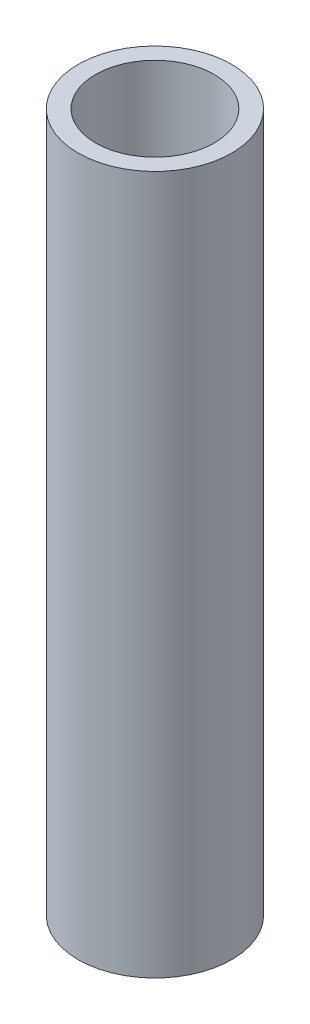
ISO-10303-21;
HEADER;
FILE_DESCRIPTION(('STEP AP214'),'2;1');
FILE_NAME('part.step','',(''),(''),'','','');
FILE_SCHEMA(('AUTOMOTIVE_DESIGN { 1 0 10303 214 1 1 1 1 }'));
ENDSEC;
DATA;
#1=APPLICATION_CONTEXT('core data for automotive mechanical design processes');
#2=APPLICATION_PROTOCOL_DEFINITION('international standard','automotive_design',2000,#1);
#3=PRODUCT_CONTEXT('',#1,'mechanical');
#4=PRODUCT('Part','Part','',(#3));
#5=PRODUCT_RELATED_PRODUCT_CATEGORY('part','',(#4));
#6=PRODUCT_DEFINITION_FORMATION('','',#4);
#7=PRODUCT_DEFINITION_CONTEXT('part definition',#1,'design');
#8=PRODUCT_DEFINITION('design','',#6,#7);
#9=PRODUCT_DEFINITION_SHAPE('','',#8);
#10=(LENGTH_UNIT() NAMED_UNIT(*) SI_UNIT(.MILLI.,.METRE.));
#11=(NAMED_UNIT(*) PLANE_ANGLE_UNIT() SI_UNIT($,.RADIAN.));
#12=(NAMED_UNIT(*) SI_UNIT($,.STERADIAN.) SOLID_ANGLE_UNIT());
#13=UNCERTAINTY_MEASURE_WITH_UNIT(LENGTH_MEASURE(1.E-05),#10,'distance_accuracy_value','');
#14=(GEOMETRIC_REPRESENTATION_CONTEXT(3) GLOBAL_UNCERTAINTY_ASSIGNED_CONTEXT((#13)) GLOBAL_UNIT_ASSIGNED_CONTEXT((#10,
#11,#12)) REPRESENTATION_CONTEXT('',''));
#15=CARTESIAN_POINT('',(0.,0.,0.));
#16=DIRECTION('',(0.,0.,1.));
#17=DIRECTION('',(1.,0.,0.));
#18=AXIS2_PLACEMENT_3D('',#15,#16,#17);
#19=CARTESIAN_POINT('',(0.,100.,0.));
#20=DIRECTION('',(0.,1.,0.));
#21=DIRECTION('',(0.,0.,1.));
#22=AXIS2_PLACEMENT_3D('',#19,#20,#21);
#23=PLANE('',#22);
#24=CARTESIAN_POINT('',(0.,100.,0.));
#25=DIRECTION('',(0.,1.,0.));
#26=DIRECTION('',(0.,0.,1.));
#27=AXIS2_PLACEMENT_3D('',#24,#25,#26);
#28=CIRCLE('',#27,11.);
#29=CARTESIAN_POINT('',(0.,100.,11.));
#30=VERTEX_POINT('',#29);
#31=EDGE_CURVE('E10',#30,#30,#28,.T.);
#32=ORIENTED_EDGE('',*,*,#31,.T.);
#33=EDGE_LOOP('',(#32));
#34=FACE_BOUND('',#33,.T.);
#35=CARTESIAN_POINT('',(0.,100.,0.));
#36=DIRECTION('',(0.,1.,0.));
#37=DIRECTION('',(0.,0.,1.));
#38=AXIS2_PLACEMENT_3D('',#35,#36,#37);
#39=CIRCLE('',#38,8.5);
#40=CARTESIAN_POINT('',(0.,100.,8.5));
#41=VERTEX_POINT('',#40);
#42=EDGE_CURVE('E42',#41,#41,#39,.T.);
#43=ORIENTED_EDGE('',*,*,#42,.F.);
#44=EDGE_LOOP('',(#43));
#45=FACE_BOUND('',#44,.T.);
#46=ADVANCED_FACE('F31',(#34,#45),#23,.T.);
#47=CARTESIAN_POINT('',(0.,0.,0.));
#48=DIRECTION('',(0.,1.,0.));
#49=DIRECTION('',(0.,0.,1.));
#50=AXIS2_PLACEMENT_3D('',#47,#48,#49);
#51=PLANE('',#50);
#52=CARTESIAN_POINT('',(0.,0.,0.));
#53=DIRECTION('',(0.,1.,0.));
#54=DIRECTION('',(0.,0.,1.));
#55=AXIS2_PLACEMENT_3D('',#52,#53,#54);
#56=CIRCLE('',#55,11.);
#57=CARTESIAN_POINT('',(0.,0.,11.));
#58=VERTEX_POINT('',#57);
#59=EDGE_CURVE('E35',#58,#58,#56,.T.);
#60=ORIENTED_EDGE('',*,*,#59,.F.);
#61=EDGE_LOOP('',(#60));
#62=FACE_BOUND('',#61,.T.);
#63=CARTESIAN_POINT('',(0.,0.,0.));
#64=DIRECTION('',(0.,1.,0.));
#65=DIRECTION('',(0.,0.,1.));
#66=AXIS2_PLACEMENT_3D('',#63,#64,#65);
#67=CIRCLE('',#66,8.5);
#68=CARTESIAN_POINT('',(0.,0.,8.5));
#69=VERTEX_POINT('',#68);
#70=EDGE_CURVE('E44',#69,#69,#67,.T.);
#71=ORIENTED_EDGE('',*,*,#70,.T.);
#72=EDGE_LOOP('',(#71));
#73=FACE_BOUND('',#72,.T.);
#74=ADVANCED_FACE('F54',(#62,#73),#51,.F.);
#75=CARTESIAN_POINT('',(0.,100.,0.));
#76=DIRECTION('',(0.,-1.,0.));
#77=DIRECTION('',(0.,0.,-1.));
#78=AXIS2_PLACEMENT_3D('',#75,#76,#77);
#79=CYLINDRICAL_SURFACE('',#78,11.);
#80=ORIENTED_EDGE('',*,*,#31,.F.);
#81=EDGE_LOOP('',(#80));
#82=FACE_BOUND('',#81,.T.);
#83=ORIENTED_EDGE('',*,*,#59,.T.);
#84=EDGE_LOOP('',(#83));
#85=FACE_BOUND('',#84,.T.);
#86=ADVANCED_FACE('F33',(#82,#85),#79,.T.);
#87=CARTESIAN_POINT('',(0.,100.,0.));
#88=DIRECTION('',(0.,-1.,0.));
#89=DIRECTION('',(0.,0.,-1.));
#90=AXIS2_PLACEMENT_3D('',#87,#88,#89);
#91=CYLINDRICAL_SURFACE('',#90,8.5);
#92=ORIENTED_EDGE('',*,*,#42,.T.);
#93=EDGE_LOOP('',(#92));
#94=FACE_BOUND('',#93,.T.);
#95=ORIENTED_EDGE('',*,*,#70,.F.);
#96=EDGE_LOOP('',(#95));
#97=FACE_BOUND('',#96,.T.);
#98=ADVANCED_FACE('F50',(#94,#97),#91,.F.);
#99=CLOSED_SHELL('',(#46,#74,#86,#98));
#100=MANIFOLD_SOLID_BREP('B2',#99);
#101=ADVANCED_BREP_SHAPE_REPRESENTATION('',(#18,#100),#14);
#102=SHAPE_DEFINITION_REPRESENTATION(#9,#101);
ENDSEC;
END-ISO-10303-21;
